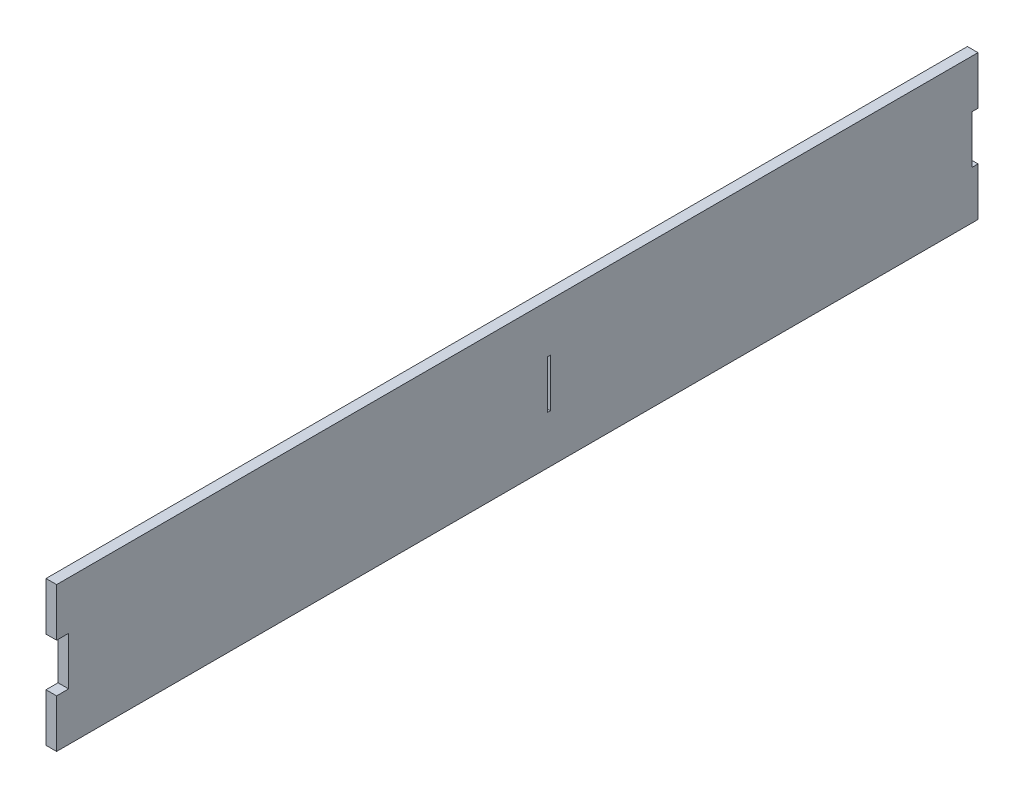
ISO-10303-21;
HEADER;
FILE_DESCRIPTION(('STEP AP214'),'2;1');
FILE_NAME('part.step','',(''),(''),'','','');
FILE_SCHEMA(('AUTOMOTIVE_DESIGN { 1 0 10303 214 1 1 1 1 }'));
ENDSEC;
DATA;
#1=APPLICATION_CONTEXT('core data for automotive mechanical design processes');
#2=APPLICATION_PROTOCOL_DEFINITION('international standard','automotive_design',2000,#1);
#3=PRODUCT_CONTEXT('',#1,'mechanical');
#4=PRODUCT('Part','Part','',(#3));
#5=PRODUCT_RELATED_PRODUCT_CATEGORY('part','',(#4));
#6=PRODUCT_DEFINITION_FORMATION('','',#4);
#7=PRODUCT_DEFINITION_CONTEXT('part definition',#1,'design');
#8=PRODUCT_DEFINITION('design','',#6,#7);
#9=PRODUCT_DEFINITION_SHAPE('','',#8);
#10=(LENGTH_UNIT() NAMED_UNIT(*) SI_UNIT(.MILLI.,.METRE.));
#11=(NAMED_UNIT(*) PLANE_ANGLE_UNIT() SI_UNIT($,.RADIAN.));
#12=(NAMED_UNIT(*) SI_UNIT($,.STERADIAN.) SOLID_ANGLE_UNIT());
#13=UNCERTAINTY_MEASURE_WITH_UNIT(LENGTH_MEASURE(1.E-05),#10,'distance_accuracy_value','');
#14=(GEOMETRIC_REPRESENTATION_CONTEXT(3) GLOBAL_UNCERTAINTY_ASSIGNED_CONTEXT((#13)) GLOBAL_UNIT_ASSIGNED_CONTEXT((#10,
#11,#12)) REPRESENTATION_CONTEXT('',''));
#15=CARTESIAN_POINT('',(0.,0.,0.));
#16=DIRECTION('',(0.,0.,1.));
#17=DIRECTION('',(1.,0.,0.));
#18=AXIS2_PLACEMENT_3D('',#15,#16,#17);
#19=CARTESIAN_POINT('',(-88.9,-8.60422844084499E-13,-196.85));
#20=DIRECTION('',(0.,0.,1.));
#21=DIRECTION('',(0.,-1.,0.));
#22=AXIS2_PLACEMENT_3D('',#19,#20,#21);
#23=PLANE('',#22);
#24=DIRECTION('',(0.,1.,0.));
#25=VECTOR('',#24,1.);
#26=CARTESIAN_POINT('',(-94.488,-8.60422844084499E-13,-196.85));
#27=LINE('',#26,#25);
#28=CARTESIAN_POINT('',(-94.488,-136.525,-196.85));
#29=VERTEX_POINT('',#28);
#30=CARTESIAN_POINT('',(-94.488,-111.125,-196.85));
#31=VERTEX_POINT('',#30);
#32=EDGE_CURVE('E193',#29,#31,#27,.T.);
#33=ORIENTED_EDGE('',*,*,#32,.F.);
#34=DIRECTION('',(-1.,0.,0.));
#35=VECTOR('',#34,1.);
#36=CARTESIAN_POINT('',(-88.9,-136.525,-196.85));
#37=LINE('',#36,#35);
#38=CARTESIAN_POINT('',(-88.9,-136.525,-196.85));
#39=VERTEX_POINT('',#38);
#40=EDGE_CURVE('E11',#39,#29,#37,.T.);
#41=ORIENTED_EDGE('',*,*,#40,.F.);
#42=DIRECTION('',(0.,1.,0.));
#43=VECTOR('',#42,1.);
#44=CARTESIAN_POINT('',(-88.9,-8.60422844084499E-13,-196.85));
#45=LINE('',#44,#43);
#46=CARTESIAN_POINT('',(-88.9,-111.125,-196.85));
#47=VERTEX_POINT('',#46);
#48=EDGE_CURVE('E271',#39,#47,#45,.T.);
#49=ORIENTED_EDGE('',*,*,#48,.T.);
#50=DIRECTION('',(-1.,0.,0.));
#51=VECTOR('',#50,1.);
#52=CARTESIAN_POINT('',(-88.9,-111.125,-196.85));
#53=LINE('',#52,#51);
#54=EDGE_CURVE('E241',#47,#31,#53,.T.);
#55=ORIENTED_EDGE('',*,*,#54,.T.);
#56=EDGE_LOOP('',(#33,#41,#49,#55));
#57=FACE_BOUND('',#56,.T.);
#58=ADVANCED_FACE('F35',(#57),#23,.T.);
#59=CARTESIAN_POINT('',(-88.9,-136.525,0.));
#60=DIRECTION('',(0.,-1.,0.));
#61=DIRECTION('',(0.,0.,-1.));
#62=AXIS2_PLACEMENT_3D('',#59,#60,#61);
#63=PLANE('',#62);
#64=DIRECTION('',(0.,0.,1.));
#65=VECTOR('',#64,1.);
#66=CARTESIAN_POINT('',(-94.488,-136.525,0.));
#67=LINE('',#66,#65);
#68=CARTESIAN_POINT('',(-94.488,-136.525,-682.625));
#69=VERTEX_POINT('',#68);
#70=EDGE_CURVE('E103',#69,#29,#67,.T.);
#71=ORIENTED_EDGE('',*,*,#70,.F.);
#72=DIRECTION('',(-1.,0.,0.));
#73=VECTOR('',#72,1.);
#74=CARTESIAN_POINT('',(-88.9,-136.525,-682.625));
#75=LINE('',#74,#73);
#76=CARTESIAN_POINT('',(-88.9,-136.525,-682.625));
#77=VERTEX_POINT('',#76);
#78=EDGE_CURVE('E45',#77,#69,#75,.T.);
#79=ORIENTED_EDGE('',*,*,#78,.F.);
#80=DIRECTION('',(0.,0.,1.));
#81=VECTOR('',#80,1.);
#82=CARTESIAN_POINT('',(-88.9,-136.525,0.));
#83=LINE('',#82,#81);
#84=EDGE_CURVE('E53',#77,#39,#83,.T.);
#85=ORIENTED_EDGE('',*,*,#84,.T.);
#86=ORIENTED_EDGE('',*,*,#40,.T.);
#87=EDGE_LOOP('',(#71,#79,#85,#86));
#88=FACE_BOUND('',#87,.T.);
#89=ADVANCED_FACE('F334',(#88),#63,.T.);
#90=CARTESIAN_POINT('',(-88.9,0.,-682.625));
#91=DIRECTION('',(0.,0.,-1.));
#92=DIRECTION('',(-1.,0.,0.));
#93=AXIS2_PLACEMENT_3D('',#90,#91,#92);
#94=PLANE('',#93);
#95=DIRECTION('',(0.,-1.,0.));
#96=VECTOR('',#95,1.);
#97=CARTESIAN_POINT('',(-94.488,0.,-682.625));
#98=LINE('',#97,#96);
#99=CARTESIAN_POINT('',(-94.488,-111.125,-682.625));
#100=VERTEX_POINT('',#99);
#101=EDGE_CURVE('E158',#100,#69,#98,.T.);
#102=ORIENTED_EDGE('',*,*,#101,.F.);
#103=DIRECTION('',(-1.,0.,0.));
#104=VECTOR('',#103,1.);
#105=CARTESIAN_POINT('',(-88.9,-111.125,-682.625));
#106=LINE('',#105,#104);
#107=CARTESIAN_POINT('',(-88.9,-111.125,-682.625));
#108=VERTEX_POINT('',#107);
#109=EDGE_CURVE('E153',#108,#100,#106,.T.);
#110=ORIENTED_EDGE('',*,*,#109,.F.);
#111=DIRECTION('',(0.,-1.,0.));
#112=VECTOR('',#111,1.);
#113=CARTESIAN_POINT('',(-88.9,0.,-682.625));
#114=LINE('',#113,#112);
#115=EDGE_CURVE('E156',#108,#77,#114,.T.);
#116=ORIENTED_EDGE('',*,*,#115,.T.);
#117=ORIENTED_EDGE('',*,*,#78,.T.);
#118=EDGE_LOOP('',(#102,#110,#116,#117));
#119=FACE_BOUND('',#118,.T.);
#120=ADVANCED_FACE('F155',(#119),#94,.T.);
#121=CARTESIAN_POINT('',(-88.9,-111.125,0.));
#122=DIRECTION('',(0.,1.,0.));
#123=DIRECTION('',(0.,0.,1.));
#124=AXIS2_PLACEMENT_3D('',#121,#122,#123);
#125=PLANE('',#124);
#126=DIRECTION('',(0.,0.,-1.));
#127=VECTOR('',#126,1.);
#128=CARTESIAN_POINT('',(-94.488,-111.125,0.));
#129=LINE('',#128,#127);
#130=CARTESIAN_POINT('',(-94.488,-111.125,-679.45));
#131=VERTEX_POINT('',#130);
#132=EDGE_CURVE('E220',#131,#100,#129,.T.);
#133=ORIENTED_EDGE('',*,*,#132,.F.);
#134=DIRECTION('',(-1.,0.,0.));
#135=VECTOR('',#134,1.);
#136=CARTESIAN_POINT('',(-88.9,-111.125,-679.45));
#137=LINE('',#136,#135);
#138=CARTESIAN_POINT('',(-88.9,-111.125,-679.45));
#139=VERTEX_POINT('',#138);
#140=EDGE_CURVE('E163',#139,#131,#137,.T.);
#141=ORIENTED_EDGE('',*,*,#140,.F.);
#142=DIRECTION('',(0.,0.,-1.));
#143=VECTOR('',#142,1.);
#144=CARTESIAN_POINT('',(-88.9,-111.125,0.));
#145=LINE('',#144,#143);
#146=EDGE_CURVE('E170',#139,#108,#145,.T.);
#147=ORIENTED_EDGE('',*,*,#146,.T.);
#148=ORIENTED_EDGE('',*,*,#109,.T.);
#149=EDGE_LOOP('',(#133,#141,#147,#148));
#150=FACE_BOUND('',#149,.T.);
#151=ADVANCED_FACE('F173',(#150),#125,.T.);
#152=CARTESIAN_POINT('',(-88.9,0.,-679.45));
#153=DIRECTION('',(0.,0.,-1.));
#154=DIRECTION('',(-1.,0.,0.));
#155=AXIS2_PLACEMENT_3D('',#152,#153,#154);
#156=PLANE('',#155);
#157=DIRECTION('',(0.,-1.,0.));
#158=VECTOR('',#157,1.);
#159=CARTESIAN_POINT('',(-94.488,0.,-679.45));
#160=LINE('',#159,#158);
#161=CARTESIAN_POINT('',(-94.488,-85.7250000000001,-679.45));
#162=VERTEX_POINT('',#161);
#163=EDGE_CURVE('E217',#162,#131,#160,.T.);
#164=ORIENTED_EDGE('',*,*,#163,.F.);
#165=DIRECTION('',(-1.,0.,0.));
#166=VECTOR('',#165,1.);
#167=CARTESIAN_POINT('',(-88.9,-85.7250000000001,-679.45));
#168=LINE('',#167,#166);
#169=CARTESIAN_POINT('',(-88.9,-85.7250000000001,-679.45));
#170=VERTEX_POINT('',#169);
#171=EDGE_CURVE('E227',#170,#162,#168,.T.);
#172=ORIENTED_EDGE('',*,*,#171,.F.);
#173=DIRECTION('',(0.,-1.,0.));
#174=VECTOR('',#173,1.);
#175=CARTESIAN_POINT('',(-88.9,0.,-679.45));
#176=LINE('',#175,#174);
#177=EDGE_CURVE('E174',#170,#139,#176,.T.);
#178=ORIENTED_EDGE('',*,*,#177,.T.);
#179=ORIENTED_EDGE('',*,*,#140,.T.);
#180=EDGE_LOOP('',(#164,#172,#178,#179));
#181=FACE_BOUND('',#180,.T.);
#182=ADVANCED_FACE('F324',(#181),#156,.T.);
#183=CARTESIAN_POINT('',(-88.9,-85.7250000000001,0.));
#184=DIRECTION('',(0.,-1.,0.));
#185=DIRECTION('',(0.,0.,-1.));
#186=AXIS2_PLACEMENT_3D('',#183,#184,#185);
#187=PLANE('',#186);
#188=DIRECTION('',(0.,0.,1.));
#189=VECTOR('',#188,1.);
#190=CARTESIAN_POINT('',(-94.488,-85.7250000000001,0.));
#191=LINE('',#190,#189);
#192=CARTESIAN_POINT('',(-94.488,-85.7250000000001,-682.625));
#193=VERTEX_POINT('',#192);
#194=EDGE_CURVE('E214',#193,#162,#191,.T.);
#195=ORIENTED_EDGE('',*,*,#194,.F.);
#196=DIRECTION('',(-1.,0.,0.));
#197=VECTOR('',#196,1.);
#198=CARTESIAN_POINT('',(-88.9,-85.7250000000001,-682.625));
#199=LINE('',#198,#197);
#200=CARTESIAN_POINT('',(-88.9,-85.7250000000001,-682.625));
#201=VERTEX_POINT('',#200);
#202=EDGE_CURVE('E229',#201,#193,#199,.T.);
#203=ORIENTED_EDGE('',*,*,#202,.F.);
#204=DIRECTION('',(0.,0.,1.));
#205=VECTOR('',#204,1.);
#206=CARTESIAN_POINT('',(-88.9,-85.7250000000001,0.));
#207=LINE('',#206,#205);
#208=EDGE_CURVE('E176',#201,#170,#207,.T.);
#209=ORIENTED_EDGE('',*,*,#208,.T.);
#210=ORIENTED_EDGE('',*,*,#171,.T.);
#211=EDGE_LOOP('',(#195,#203,#209,#210));
#212=FACE_BOUND('',#211,.T.);
#213=ADVANCED_FACE('F295',(#212),#187,.T.);
#214=CARTESIAN_POINT('',(-88.9,0.,-682.625));
#215=DIRECTION('',(0.,0.,-1.));
#216=DIRECTION('',(-1.,0.,0.));
#217=AXIS2_PLACEMENT_3D('',#214,#215,#216);
#218=PLANE('',#217);
#219=DIRECTION('',(0.,-1.,0.));
#220=VECTOR('',#219,1.);
#221=CARTESIAN_POINT('',(-94.488,0.,-682.625));
#222=LINE('',#221,#220);
#223=CARTESIAN_POINT('',(-94.488,-60.3250000000001,-682.625));
#224=VERTEX_POINT('',#223);
#225=EDGE_CURVE('E211',#224,#193,#222,.T.);
#226=ORIENTED_EDGE('',*,*,#225,.F.);
#227=DIRECTION('',(-1.,0.,0.));
#228=VECTOR('',#227,1.);
#229=CARTESIAN_POINT('',(-88.9,-60.3250000000001,-682.625));
#230=LINE('',#229,#228);
#231=CARTESIAN_POINT('',(-88.9,-60.3250000000001,-682.625));
#232=VERTEX_POINT('',#231);
#233=EDGE_CURVE('E231',#232,#224,#230,.T.);
#234=ORIENTED_EDGE('',*,*,#233,.F.);
#235=DIRECTION('',(0.,-1.,0.));
#236=VECTOR('',#235,1.);
#237=CARTESIAN_POINT('',(-88.9,0.,-682.625));
#238=LINE('',#237,#236);
#239=EDGE_CURVE('E289',#232,#201,#238,.T.);
#240=ORIENTED_EDGE('',*,*,#239,.T.);
#241=ORIENTED_EDGE('',*,*,#202,.T.);
#242=EDGE_LOOP('',(#226,#234,#240,#241));
#243=FACE_BOUND('',#242,.T.);
#244=ADVANCED_FACE('F301',(#243),#218,.T.);
#245=CARTESIAN_POINT('',(-88.9,-60.325,0.));
#246=DIRECTION('',(0.,1.,0.));
#247=DIRECTION('',(0.,0.,1.));
#248=AXIS2_PLACEMENT_3D('',#245,#246,#247);
#249=PLANE('',#248);
#250=DIRECTION('',(0.,0.,-1.));
#251=VECTOR('',#250,1.);
#252=CARTESIAN_POINT('',(-94.488,-60.325,0.));
#253=LINE('',#252,#251);
#254=CARTESIAN_POINT('',(-94.488,-60.325,-196.85));
#255=VERTEX_POINT('',#254);
#256=EDGE_CURVE('E208',#255,#224,#253,.T.);
#257=ORIENTED_EDGE('',*,*,#256,.F.);
#258=DIRECTION('',(-1.,0.,0.));
#259=VECTOR('',#258,1.);
#260=CARTESIAN_POINT('',(-88.9,-60.325,-196.85));
#261=LINE('',#260,#259);
#262=CARTESIAN_POINT('',(-88.9,-60.325,-196.85));
#263=VERTEX_POINT('',#262);
#264=EDGE_CURVE('E233',#263,#255,#261,.T.);
#265=ORIENTED_EDGE('',*,*,#264,.F.);
#266=DIRECTION('',(0.,0.,-1.));
#267=VECTOR('',#266,1.);
#268=CARTESIAN_POINT('',(-88.9,-60.325,0.));
#269=LINE('',#268,#267);
#270=EDGE_CURVE('E286',#263,#232,#269,.T.);
#271=ORIENTED_EDGE('',*,*,#270,.T.);
#272=ORIENTED_EDGE('',*,*,#233,.T.);
#273=EDGE_LOOP('',(#257,#265,#271,#272));
#274=FACE_BOUND('',#273,.T.);
#275=ADVANCED_FACE('F304',(#274),#249,.T.);
#276=CARTESIAN_POINT('',(-88.9,8.60422844084493E-13,-196.85));
#277=DIRECTION('',(0.,0.,1.));
#278=DIRECTION('',(0.,-1.,0.));
#279=AXIS2_PLACEMENT_3D('',#276,#277,#278);
#280=PLANE('',#279);
#281=DIRECTION('',(0.,1.,0.));
#282=VECTOR('',#281,1.);
#283=CARTESIAN_POINT('',(-94.488,8.60422844084493E-13,-196.85));
#284=LINE('',#283,#282);
#285=CARTESIAN_POINT('',(-94.488,-85.7250000000001,-196.85));
#286=VERTEX_POINT('',#285);
#287=EDGE_CURVE('E205',#286,#255,#284,.T.);
#288=ORIENTED_EDGE('',*,*,#287,.F.);
#289=DIRECTION('',(-1.,0.,0.));
#290=VECTOR('',#289,1.);
#291=CARTESIAN_POINT('',(-88.9,-85.7250000000001,-196.85));
#292=LINE('',#291,#290);
#293=CARTESIAN_POINT('',(-88.9,-85.7250000000001,-196.85));
#294=VERTEX_POINT('',#293);
#295=EDGE_CURVE('E235',#294,#286,#292,.T.);
#296=ORIENTED_EDGE('',*,*,#295,.F.);
#297=DIRECTION('',(0.,1.,0.));
#298=VECTOR('',#297,1.);
#299=CARTESIAN_POINT('',(-88.9,8.60422844084493E-13,-196.85));
#300=LINE('',#299,#298);
#301=EDGE_CURVE('E283',#294,#263,#300,.T.);
#302=ORIENTED_EDGE('',*,*,#301,.T.);
#303=ORIENTED_EDGE('',*,*,#264,.T.);
#304=EDGE_LOOP('',(#288,#296,#302,#303));
#305=FACE_BOUND('',#304,.T.);
#306=ADVANCED_FACE('F309',(#305),#280,.T.);
#307=CARTESIAN_POINT('',(-88.9,-85.7249999999983,7.4940054162198E-13));
#308=DIRECTION('',(0.,-1.,0.));
#309=DIRECTION('',(0.,0.,-1.));
#310=AXIS2_PLACEMENT_3D('',#307,#308,#309);
#311=PLANE('',#310);
#312=DIRECTION('',(0.,0.,1.));
#313=VECTOR('',#312,1.);
#314=CARTESIAN_POINT('',(-94.488,-85.7249999999983,7.4940054162198E-13));
#315=LINE('',#314,#313);
#316=CARTESIAN_POINT('',(-94.488,-85.7250000000001,-203.2));
#317=VERTEX_POINT('',#316);
#318=EDGE_CURVE('E202',#317,#286,#315,.T.);
#319=ORIENTED_EDGE('',*,*,#318,.F.);
#320=DIRECTION('',(-1.,0.,0.));
#321=VECTOR('',#320,1.);
#322=CARTESIAN_POINT('',(-88.9,-85.7250000000001,-203.2));
#323=LINE('',#322,#321);
#324=CARTESIAN_POINT('',(-88.9,-85.7250000000001,-203.2));
#325=VERTEX_POINT('',#324);
#326=EDGE_CURVE('E237',#325,#317,#323,.T.);
#327=ORIENTED_EDGE('',*,*,#326,.F.);
#328=DIRECTION('',(0.,0.,1.));
#329=VECTOR('',#328,1.);
#330=CARTESIAN_POINT('',(-88.9,-85.7249999999983,7.4940054162198E-13));
#331=LINE('',#330,#329);
#332=EDGE_CURVE('E280',#325,#294,#331,.T.);
#333=ORIENTED_EDGE('',*,*,#332,.T.);
#334=ORIENTED_EDGE('',*,*,#295,.T.);
#335=EDGE_LOOP('',(#319,#327,#333,#334));
#336=FACE_BOUND('',#335,.T.);
#337=ADVANCED_FACE('F312',(#336),#311,.T.);
#338=CARTESIAN_POINT('',(-88.9,0.,-203.2));
#339=DIRECTION('',(0.,0.,1.));
#340=DIRECTION('',(1.,0.,0.));
#341=AXIS2_PLACEMENT_3D('',#338,#339,#340);
#342=PLANE('',#341);
#343=DIRECTION('',(0.,1.,0.));
#344=VECTOR('',#343,1.);
#345=CARTESIAN_POINT('',(-94.488,0.,-203.2));
#346=LINE('',#345,#344);
#347=CARTESIAN_POINT('',(-94.488,-111.125,-203.2));
#348=VERTEX_POINT('',#347);
#349=EDGE_CURVE('E199',#348,#317,#346,.T.);
#350=ORIENTED_EDGE('',*,*,#349,.F.);
#351=DIRECTION('',(-1.,0.,0.));
#352=VECTOR('',#351,1.);
#353=CARTESIAN_POINT('',(-88.9,-111.125,-203.2));
#354=LINE('',#353,#352);
#355=CARTESIAN_POINT('',(-88.9,-111.125,-203.2));
#356=VERTEX_POINT('',#355);
#357=EDGE_CURVE('E239',#356,#348,#354,.T.);
#358=ORIENTED_EDGE('',*,*,#357,.F.);
#359=DIRECTION('',(0.,1.,0.));
#360=VECTOR('',#359,1.);
#361=CARTESIAN_POINT('',(-88.9,0.,-203.2));
#362=LINE('',#361,#360);
#363=EDGE_CURVE('E277',#356,#325,#362,.T.);
#364=ORIENTED_EDGE('',*,*,#363,.T.);
#365=ORIENTED_EDGE('',*,*,#326,.T.);
#366=EDGE_LOOP('',(#350,#358,#364,#365));
#367=FACE_BOUND('',#366,.T.);
#368=ADVANCED_FACE('F317',(#367),#342,.T.);
#369=CARTESIAN_POINT('',(-88.9,0.,-455.6125));
#370=DIRECTION('',(0.,0.,-1.));
#371=DIRECTION('',(-1.,0.,0.));
#372=AXIS2_PLACEMENT_3D('',#369,#370,#371);
#373=PLANE('',#372);
#374=DIRECTION('',(0.,-1.,0.));
#375=VECTOR('',#374,1.);
#376=CARTESIAN_POINT('',(-94.488,0.,-455.6125));
#377=LINE('',#376,#375);
#378=CARTESIAN_POINT('',(-94.488,-85.7250000000001,-455.6125));
#379=VERTEX_POINT('',#378);
#380=CARTESIAN_POINT('',(-94.488,-111.125,-455.6125));
#381=VERTEX_POINT('',#380);
#382=EDGE_CURVE('E181',#379,#381,#377,.T.);
#383=ORIENTED_EDGE('',*,*,#382,.F.);
#384=DIRECTION('',(-1.,0.,0.));
#385=VECTOR('',#384,1.);
#386=CARTESIAN_POINT('',(-88.9,-85.7250000000001,-455.6125));
#387=LINE('',#386,#385);
#388=CARTESIAN_POINT('',(-88.9,-85.7250000000001,-455.6125));
#389=VERTEX_POINT('',#388);
#390=EDGE_CURVE('E243',#389,#379,#387,.T.);
#391=ORIENTED_EDGE('',*,*,#390,.F.);
#392=DIRECTION('',(0.,-1.,0.));
#393=VECTOR('',#392,1.);
#394=CARTESIAN_POINT('',(-88.9,0.,-455.6125));
#395=LINE('',#394,#393);
#396=CARTESIAN_POINT('',(-88.9,-111.125,-455.6125));
#397=VERTEX_POINT('',#396);
#398=EDGE_CURVE('E223',#389,#397,#395,.T.);
#399=ORIENTED_EDGE('',*,*,#398,.T.);
#400=DIRECTION('',(-1.,0.,0.));
#401=VECTOR('',#400,1.);
#402=CARTESIAN_POINT('',(-88.9,-111.125,-455.6125));
#403=LINE('',#402,#401);
#404=EDGE_CURVE('E39',#397,#381,#403,.T.);
#405=ORIENTED_EDGE('',*,*,#404,.T.);
#406=EDGE_LOOP('',(#383,#391,#399,#405));
#407=FACE_BOUND('',#406,.T.);
#408=ADVANCED_FACE('F37',(#407),#373,.T.);
#409=CARTESIAN_POINT('',(-88.9,-85.7250000000001,0.));
#410=DIRECTION('',(0.,-1.,0.));
#411=DIRECTION('',(0.,0.,-1.));
#412=AXIS2_PLACEMENT_3D('',#409,#410,#411);
#413=PLANE('',#412);
#414=DIRECTION('',(0.,0.,1.));
#415=VECTOR('',#414,1.);
#416=CARTESIAN_POINT('',(-94.488,-85.7250000000001,0.));
#417=LINE('',#416,#415);
#418=CARTESIAN_POINT('',(-94.488,-85.7250000000001,-457.2));
#419=VERTEX_POINT('',#418);
#420=EDGE_CURVE('E190',#419,#379,#417,.T.);
#421=ORIENTED_EDGE('',*,*,#420,.F.);
#422=DIRECTION('',(-1.,0.,0.));
#423=VECTOR('',#422,1.);
#424=CARTESIAN_POINT('',(-88.9,-85.7250000000001,-457.2));
#425=LINE('',#424,#423);
#426=CARTESIAN_POINT('',(-88.9,-85.7250000000001,-457.2));
#427=VERTEX_POINT('',#426);
#428=EDGE_CURVE('E245',#427,#419,#425,.T.);
#429=ORIENTED_EDGE('',*,*,#428,.F.);
#430=DIRECTION('',(0.,0.,1.));
#431=VECTOR('',#430,1.);
#432=CARTESIAN_POINT('',(-88.9,-85.7250000000001,0.));
#433=LINE('',#432,#431);
#434=EDGE_CURVE('E261',#427,#389,#433,.T.);
#435=ORIENTED_EDGE('',*,*,#434,.T.);
#436=ORIENTED_EDGE('',*,*,#390,.T.);
#437=EDGE_LOOP('',(#421,#429,#435,#436));
#438=FACE_BOUND('',#437,.T.);
#439=ADVANCED_FACE('F257',(#438),#413,.T.);
#440=CARTESIAN_POINT('',(-88.9,0.,-457.2));
#441=DIRECTION('',(0.,0.,1.));
#442=DIRECTION('',(1.,0.,0.));
#443=AXIS2_PLACEMENT_3D('',#440,#441,#442);
#444=PLANE('',#443);
#445=DIRECTION('',(0.,1.,0.));
#446=VECTOR('',#445,1.);
#447=CARTESIAN_POINT('',(-94.488,0.,-457.2));
#448=LINE('',#447,#446);
#449=CARTESIAN_POINT('',(-94.488,-111.125,-457.2));
#450=VERTEX_POINT('',#449);
#451=EDGE_CURVE('E187',#450,#419,#448,.T.);
#452=ORIENTED_EDGE('',*,*,#451,.F.);
#453=DIRECTION('',(-1.,0.,0.));
#454=VECTOR('',#453,1.);
#455=CARTESIAN_POINT('',(-88.9,-111.125,-457.2));
#456=LINE('',#455,#454);
#457=CARTESIAN_POINT('',(-88.9,-111.125,-457.2));
#458=VERTEX_POINT('',#457);
#459=EDGE_CURVE('E246',#458,#450,#456,.T.);
#460=ORIENTED_EDGE('',*,*,#459,.F.);
#461=DIRECTION('',(0.,1.,0.));
#462=VECTOR('',#461,1.);
#463=CARTESIAN_POINT('',(-88.9,0.,-457.2));
#464=LINE('',#463,#462);
#465=EDGE_CURVE('E266',#458,#427,#464,.T.);
#466=ORIENTED_EDGE('',*,*,#465,.T.);
#467=ORIENTED_EDGE('',*,*,#428,.T.);
#468=EDGE_LOOP('',(#452,#460,#466,#467));
#469=FACE_BOUND('',#468,.T.);
#470=ADVANCED_FACE('F346',(#469),#444,.T.);
#471=CARTESIAN_POINT('',(-88.9,-111.125,0.));
#472=DIRECTION('',(0.,1.,0.));
#473=DIRECTION('',(0.,0.,1.));
#474=AXIS2_PLACEMENT_3D('',#471,#472,#473);
#475=PLANE('',#474);
#476=DIRECTION('',(0.,0.,-1.));
#477=VECTOR('',#476,1.);
#478=CARTESIAN_POINT('',(-94.488,-111.125,0.));
#479=LINE('',#478,#477);
#480=EDGE_CURVE('E184',#381,#450,#479,.T.);
#481=ORIENTED_EDGE('',*,*,#480,.F.);
#482=ORIENTED_EDGE('',*,*,#404,.F.);
#483=DIRECTION('',(0.,0.,-1.));
#484=VECTOR('',#483,1.);
#485=CARTESIAN_POINT('',(-88.9,-111.125,0.));
#486=LINE('',#485,#484);
#487=EDGE_CURVE('E264',#397,#458,#486,.T.);
#488=ORIENTED_EDGE('',*,*,#487,.T.);
#489=ORIENTED_EDGE('',*,*,#459,.T.);
#490=EDGE_LOOP('',(#481,#482,#488,#489));
#491=FACE_BOUND('',#490,.T.);
#492=ADVANCED_FACE('F252',(#491),#475,.T.);
#493=CARTESIAN_POINT('',(-88.9,-111.124999999999,4.85722573273509E-13));
#494=DIRECTION('',(0.,1.,0.));
#495=DIRECTION('',(0.,0.,1.));
#496=AXIS2_PLACEMENT_3D('',#493,#494,#495);
#497=PLANE('',#496);
#498=DIRECTION('',(0.,0.,-1.));
#499=VECTOR('',#498,1.);
#500=CARTESIAN_POINT('',(-94.488,-111.124999999999,4.85722573273509E-13));
#501=LINE('',#500,#499);
#502=EDGE_CURVE('E196',#31,#348,#501,.T.);
#503=ORIENTED_EDGE('',*,*,#502,.F.);
#504=ORIENTED_EDGE('',*,*,#54,.F.);
#505=DIRECTION('',(0.,0.,-1.));
#506=VECTOR('',#505,1.);
#507=CARTESIAN_POINT('',(-88.9,-111.124999999999,4.85722573273509E-13));
#508=LINE('',#507,#506);
#509=EDGE_CURVE('E274',#47,#356,#508,.T.);
#510=ORIENTED_EDGE('',*,*,#509,.T.);
#511=ORIENTED_EDGE('',*,*,#357,.T.);
#512=EDGE_LOOP('',(#503,#504,#510,#511));
#513=FACE_BOUND('',#512,.T.);
#514=ADVANCED_FACE('F320',(#513),#497,.T.);
#515=CARTESIAN_POINT('',(-88.9,0.,0.));
#516=DIRECTION('',(-1.,0.,0.));
#517=DIRECTION('',(0.,0.,1.));
#518=AXIS2_PLACEMENT_3D('',#515,#516,#517);
#519=PLANE('',#518);
#520=ORIENTED_EDGE('',*,*,#398,.F.);
#521=ORIENTED_EDGE('',*,*,#434,.F.);
#522=ORIENTED_EDGE('',*,*,#465,.F.);
#523=ORIENTED_EDGE('',*,*,#487,.F.);
#524=EDGE_LOOP('',(#520,#521,#522,#523));
#525=FACE_BOUND('',#524,.T.);
#526=ORIENTED_EDGE('',*,*,#48,.F.);
#527=ORIENTED_EDGE('',*,*,#84,.F.);
#528=ORIENTED_EDGE('',*,*,#115,.F.);
#529=ORIENTED_EDGE('',*,*,#146,.F.);
#530=ORIENTED_EDGE('',*,*,#177,.F.);
#531=ORIENTED_EDGE('',*,*,#208,.F.);
#532=ORIENTED_EDGE('',*,*,#239,.F.);
#533=ORIENTED_EDGE('',*,*,#270,.F.);
#534=ORIENTED_EDGE('',*,*,#301,.F.);
#535=ORIENTED_EDGE('',*,*,#332,.F.);
#536=ORIENTED_EDGE('',*,*,#363,.F.);
#537=ORIENTED_EDGE('',*,*,#509,.F.);
#538=EDGE_LOOP('',(#526,#527,#528,#529,#530,#531,#532,#533,#534,#535,#536,#537));
#539=FACE_BOUND('',#538,.T.);
#540=ADVANCED_FACE('F168',(#525,#539),#519,.F.);
#541=CARTESIAN_POINT('',(-94.488,0.,0.));
#542=DIRECTION('',(-1.,0.,0.));
#543=DIRECTION('',(0.,0.,1.));
#544=AXIS2_PLACEMENT_3D('',#541,#542,#543);
#545=PLANE('',#544);
#546=ORIENTED_EDGE('',*,*,#101,.T.);
#547=ORIENTED_EDGE('',*,*,#70,.T.);
#548=ORIENTED_EDGE('',*,*,#32,.T.);
#549=ORIENTED_EDGE('',*,*,#502,.T.);
#550=ORIENTED_EDGE('',*,*,#349,.T.);
#551=ORIENTED_EDGE('',*,*,#318,.T.);
#552=ORIENTED_EDGE('',*,*,#287,.T.);
#553=ORIENTED_EDGE('',*,*,#256,.T.);
#554=ORIENTED_EDGE('',*,*,#225,.T.);
#555=ORIENTED_EDGE('',*,*,#194,.T.);
#556=ORIENTED_EDGE('',*,*,#163,.T.);
#557=ORIENTED_EDGE('',*,*,#132,.T.);
#558=EDGE_LOOP('',(#546,#547,#548,#549,#550,#551,#552,#553,#554,#555,#556,#557));
#559=FACE_BOUND('',#558,.T.);
#560=ORIENTED_EDGE('',*,*,#382,.T.);
#561=ORIENTED_EDGE('',*,*,#480,.T.);
#562=ORIENTED_EDGE('',*,*,#451,.T.);
#563=ORIENTED_EDGE('',*,*,#420,.T.);
#564=EDGE_LOOP('',(#560,#561,#562,#563));
#565=FACE_BOUND('',#564,.T.);
#566=ADVANCED_FACE('F254',(#559,#565),#545,.T.);
#567=CLOSED_SHELL('',(#58,#89,#120,#151,#182,#213,#244,#275,#306,#337,#368,#408,#439,#470,#492,
#514,#540,#566));
#568=MANIFOLD_SOLID_BREP('B2',#567);
#569=ADVANCED_BREP_SHAPE_REPRESENTATION('',(#18,#568),#14);
#570=SHAPE_DEFINITION_REPRESENTATION(#9,#569);
ENDSEC;
END-ISO-10303-21;
